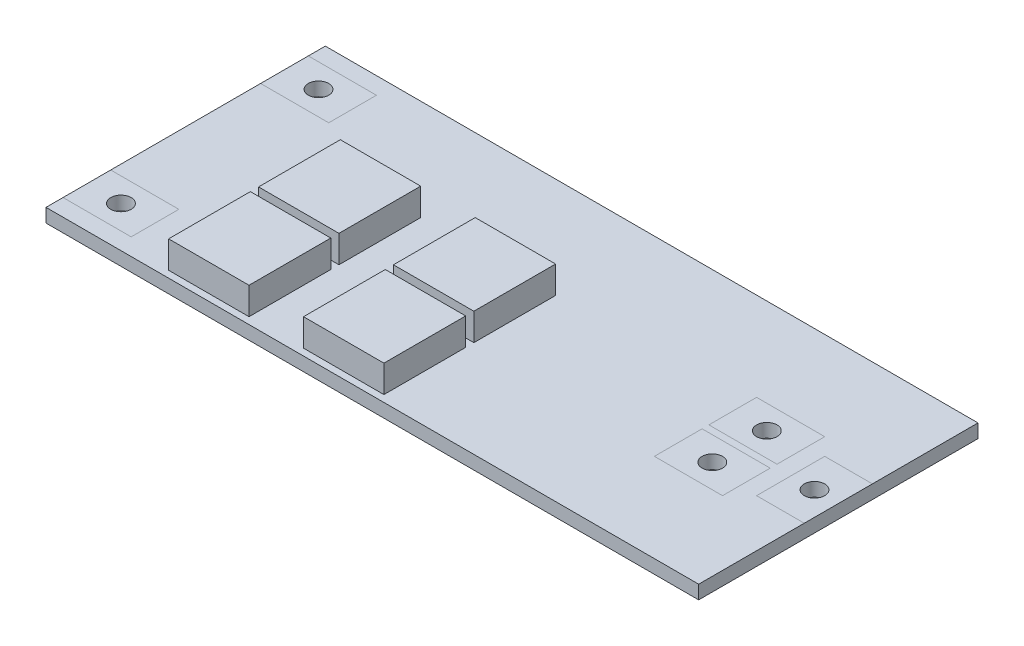
ISO-10303-21;
HEADER;
FILE_DESCRIPTION(('STEP AP214'),'2;1');
FILE_NAME('part.step','',(''),(''),'','','');
FILE_SCHEMA(('AUTOMOTIVE_DESIGN { 1 0 10303 214 1 1 1 1 }'));
ENDSEC;
DATA;
#1=APPLICATION_CONTEXT('core data for automotive mechanical design processes');
#2=APPLICATION_PROTOCOL_DEFINITION('international standard','automotive_design',2000,#1);
#3=PRODUCT_CONTEXT('',#1,'mechanical');
#4=PRODUCT('Part','Part','',(#3));
#5=PRODUCT_RELATED_PRODUCT_CATEGORY('part','',(#4));
#6=PRODUCT_DEFINITION_FORMATION('','',#4);
#7=PRODUCT_DEFINITION_CONTEXT('part definition',#1,'design');
#8=PRODUCT_DEFINITION('design','',#6,#7);
#9=PRODUCT_DEFINITION_SHAPE('','',#8);
#10=(LENGTH_UNIT() NAMED_UNIT(*) SI_UNIT(.MILLI.,.METRE.));
#11=(NAMED_UNIT(*) PLANE_ANGLE_UNIT() SI_UNIT($,.RADIAN.));
#12=(NAMED_UNIT(*) SI_UNIT($,.STERADIAN.) SOLID_ANGLE_UNIT());
#13=UNCERTAINTY_MEASURE_WITH_UNIT(LENGTH_MEASURE(1.E-05),#10,'distance_accuracy_value','');
#14=(GEOMETRIC_REPRESENTATION_CONTEXT(3) GLOBAL_UNCERTAINTY_ASSIGNED_CONTEXT((#13)) GLOBAL_UNIT_ASSIGNED_CONTEXT((#10,
#11,#12)) REPRESENTATION_CONTEXT('',''));
#15=CARTESIAN_POINT('',(0.,0.,0.));
#16=DIRECTION('',(0.,0.,1.));
#17=DIRECTION('',(1.,0.,0.));
#18=AXIS2_PLACEMENT_3D('',#15,#16,#17);
#19=CARTESIAN_POINT('',(0.350000000000003,3.,-2.84999999999999));
#20=DIRECTION('',(-1.,0.,0.));
#21=DIRECTION('',(0.,0.,1.));
#22=AXIS2_PLACEMENT_3D('',#19,#20,#21);
#23=PLANE('',#22);
#24=DIRECTION('',(0.,0.,-1.));
#25=VECTOR('',#24,1.);
#26=CARTESIAN_POINT('',(0.350000000000003,1.,-2.84999999999999));
#27=LINE('',#26,#25);
#28=CARTESIAN_POINT('',(0.350000000000003,1.,3.15000000000001));
#29=VERTEX_POINT('',#28);
#30=CARTESIAN_POINT('',(0.350000000000003,1.,-2.84999999999999));
#31=VERTEX_POINT('',#30);
#32=EDGE_CURVE('E12',#29,#31,#27,.T.);
#33=ORIENTED_EDGE('',*,*,#32,.T.);
#34=DIRECTION('',(0.,-1.,0.));
#35=VECTOR('',#34,1.);
#36=CARTESIAN_POINT('',(0.350000000000003,3.,-2.84999999999999));
#37=LINE('',#36,#35);
#38=CARTESIAN_POINT('',(0.350000000000003,3.,-2.84999999999999));
#39=VERTEX_POINT('',#38);
#40=EDGE_CURVE('E131',#39,#31,#37,.T.);
#41=ORIENTED_EDGE('',*,*,#40,.F.);
#42=DIRECTION('',(0.,0.,-1.));
#43=VECTOR('',#42,1.);
#44=CARTESIAN_POINT('',(0.350000000000003,3.,-2.84999999999999));
#45=LINE('',#44,#43);
#46=CARTESIAN_POINT('',(0.350000000000003,3.,3.15000000000001));
#47=VERTEX_POINT('',#46);
#48=EDGE_CURVE('E64',#47,#39,#45,.T.);
#49=ORIENTED_EDGE('',*,*,#48,.F.);
#50=DIRECTION('',(0.,-1.,0.));
#51=VECTOR('',#50,1.);
#52=CARTESIAN_POINT('',(0.350000000000003,3.,3.15000000000001));
#53=LINE('',#52,#51);
#54=EDGE_CURVE('E119',#47,#29,#53,.T.);
#55=ORIENTED_EDGE('',*,*,#54,.T.);
#56=EDGE_LOOP('',(#33,#41,#49,#55));
#57=FACE_BOUND('',#56,.T.);
#58=ADVANCED_FACE('F60',(#57),#23,.F.);
#59=CARTESIAN_POINT('',(0.350000000000003,3.,-2.84999999999999));
#60=DIRECTION('',(0.,0.,1.));
#61=DIRECTION('',(1.,0.,0.));
#62=AXIS2_PLACEMENT_3D('',#59,#60,#61);
#63=PLANE('',#62);
#64=DIRECTION('',(-1.,0.,0.));
#65=VECTOR('',#64,1.);
#66=CARTESIAN_POINT('',(0.350000000000003,1.,-2.84999999999999));
#67=LINE('',#66,#65);
#68=CARTESIAN_POINT('',(-5.55,1.,-2.85));
#69=VERTEX_POINT('',#68);
#70=EDGE_CURVE('E70',#31,#69,#67,.T.);
#71=ORIENTED_EDGE('',*,*,#70,.T.);
#72=DIRECTION('',(0.,-1.,0.));
#73=VECTOR('',#72,1.);
#74=CARTESIAN_POINT('',(-5.55,3.,-2.85));
#75=LINE('',#74,#73);
#76=CARTESIAN_POINT('',(-5.55,3.,-2.85));
#77=VERTEX_POINT('',#76);
#78=EDGE_CURVE('E115',#77,#69,#75,.T.);
#79=ORIENTED_EDGE('',*,*,#78,.F.);
#80=DIRECTION('',(-1.,0.,0.));
#81=VECTOR('',#80,1.);
#82=CARTESIAN_POINT('',(0.350000000000003,3.,-2.84999999999999));
#83=LINE('',#82,#81);
#84=EDGE_CURVE('E94',#39,#77,#83,.T.);
#85=ORIENTED_EDGE('',*,*,#84,.F.);
#86=ORIENTED_EDGE('',*,*,#40,.T.);
#87=EDGE_LOOP('',(#71,#79,#85,#86));
#88=FACE_BOUND('',#87,.T.);
#89=ADVANCED_FACE('F134',(#88),#63,.F.);
#90=CARTESIAN_POINT('',(-5.55,3.,-2.85));
#91=DIRECTION('',(1.,0.,0.));
#92=DIRECTION('',(0.,0.,-1.));
#93=AXIS2_PLACEMENT_3D('',#90,#91,#92);
#94=PLANE('',#93);
#95=DIRECTION('',(0.,0.,1.));
#96=VECTOR('',#95,1.);
#97=CARTESIAN_POINT('',(-5.55,1.,-2.85));
#98=LINE('',#97,#96);
#99=CARTESIAN_POINT('',(-5.55,1.,3.15));
#100=VERTEX_POINT('',#99);
#101=EDGE_CURVE('E110',#69,#100,#98,.T.);
#102=ORIENTED_EDGE('',*,*,#101,.T.);
#103=DIRECTION('',(0.,-1.,0.));
#104=VECTOR('',#103,1.);
#105=CARTESIAN_POINT('',(-5.55,3.,3.15));
#106=LINE('',#105,#104);
#107=CARTESIAN_POINT('',(-5.55,3.,3.15));
#108=VERTEX_POINT('',#107);
#109=EDGE_CURVE('E113',#108,#100,#106,.T.);
#110=ORIENTED_EDGE('',*,*,#109,.F.);
#111=DIRECTION('',(0.,0.,1.));
#112=VECTOR('',#111,1.);
#113=CARTESIAN_POINT('',(-5.55,3.,-2.85));
#114=LINE('',#113,#112);
#115=EDGE_CURVE('E127',#77,#108,#114,.T.);
#116=ORIENTED_EDGE('',*,*,#115,.F.);
#117=ORIENTED_EDGE('',*,*,#78,.T.);
#118=EDGE_LOOP('',(#102,#110,#116,#117));
#119=FACE_BOUND('',#118,.T.);
#120=ADVANCED_FACE('F111',(#119),#94,.F.);
#121=CARTESIAN_POINT('',(0.350000000000003,3.,3.15000000000001));
#122=DIRECTION('',(0.,0.,-1.));
#123=DIRECTION('',(-1.,0.,0.));
#124=AXIS2_PLACEMENT_3D('',#121,#122,#123);
#125=PLANE('',#124);
#126=DIRECTION('',(1.,0.,0.));
#127=VECTOR('',#126,1.);
#128=CARTESIAN_POINT('',(0.350000000000003,1.,3.15000000000001));
#129=LINE('',#128,#127);
#130=EDGE_CURVE('E104',#100,#29,#129,.T.);
#131=ORIENTED_EDGE('',*,*,#130,.T.);
#132=ORIENTED_EDGE('',*,*,#54,.F.);
#133=DIRECTION('',(1.,0.,0.));
#134=VECTOR('',#133,1.);
#135=CARTESIAN_POINT('',(0.350000000000003,3.,3.15000000000001));
#136=LINE('',#135,#134);
#137=EDGE_CURVE('E118',#108,#47,#136,.T.);
#138=ORIENTED_EDGE('',*,*,#137,.F.);
#139=ORIENTED_EDGE('',*,*,#109,.T.);
#140=EDGE_LOOP('',(#131,#132,#138,#139));
#141=FACE_BOUND('',#140,.T.);
#142=ADVANCED_FACE('F117',(#141),#125,.F.);
#143=CARTESIAN_POINT('',(0.,3.,0.));
#144=DIRECTION('',(0.,-1.,0.));
#145=DIRECTION('',(0.,0.,-1.));
#146=AXIS2_PLACEMENT_3D('',#143,#144,#145);
#147=PLANE('',#146);
#148=ORIENTED_EDGE('',*,*,#48,.T.);
#149=ORIENTED_EDGE('',*,*,#84,.T.);
#150=ORIENTED_EDGE('',*,*,#115,.T.);
#151=ORIENTED_EDGE('',*,*,#137,.T.);
#152=EDGE_LOOP('',(#148,#149,#150,#151));
#153=FACE_BOUND('',#152,.T.);
#154=ADVANCED_FACE('F62',(#153),#147,.F.);
#155=CARTESIAN_POINT('',(0.,1.,0.));
#156=DIRECTION('',(0.,-1.,0.));
#157=DIRECTION('',(0.,0.,-1.));
#158=AXIS2_PLACEMENT_3D('',#155,#156,#157);
#159=PLANE('',#158);
#160=ORIENTED_EDGE('',*,*,#32,.F.);
#161=ORIENTED_EDGE('',*,*,#130,.F.);
#162=ORIENTED_EDGE('',*,*,#101,.F.);
#163=ORIENTED_EDGE('',*,*,#70,.F.);
#164=EDGE_LOOP('',(#160,#161,#162,#163));
#165=FACE_BOUND('',#164,.T.);
#166=ADVANCED_FACE('F121',(#165),#159,.T.);
#167=CLOSED_SHELL('',(#58,#89,#120,#142,#154,#166));
#168=MANIFOLD_SOLID_BREP('B2',#167);
#169=CARTESIAN_POINT('',(0.350000000000001,3.,3.75000000000001));
#170=DIRECTION('',(-1.,0.,0.));
#171=DIRECTION('',(0.,0.,1.));
#172=AXIS2_PLACEMENT_3D('',#169,#170,#171);
#173=PLANE('',#172);
#174=DIRECTION('',(0.,0.,-1.));
#175=VECTOR('',#174,1.);
#176=CARTESIAN_POINT('',(0.350000000000001,1.,3.75000000000001));
#177=LINE('',#176,#175);
#178=CARTESIAN_POINT('',(0.349999999999996,1.,9.75000000000001));
#179=VERTEX_POINT('',#178);
#180=CARTESIAN_POINT('',(0.350000000000001,1.,3.75000000000001));
#181=VERTEX_POINT('',#180);
#182=EDGE_CURVE('E58',#179,#181,#177,.T.);
#183=ORIENTED_EDGE('',*,*,#182,.T.);
#184=DIRECTION('',(0.,-1.,0.));
#185=VECTOR('',#184,1.);
#186=CARTESIAN_POINT('',(0.350000000000001,3.,3.75000000000001));
#187=LINE('',#186,#185);
#188=CARTESIAN_POINT('',(0.350000000000001,3.,3.75000000000001));
#189=VERTEX_POINT('',#188);
#190=EDGE_CURVE('E265',#189,#181,#187,.T.);
#191=ORIENTED_EDGE('',*,*,#190,.F.);
#192=DIRECTION('',(0.,0.,-1.));
#193=VECTOR('',#192,1.);
#194=CARTESIAN_POINT('',(0.350000000000001,3.,3.75000000000001));
#195=LINE('',#194,#193);
#196=CARTESIAN_POINT('',(0.349999999999996,3.,9.75000000000001));
#197=VERTEX_POINT('',#196);
#198=EDGE_CURVE('E198',#197,#189,#195,.T.);
#199=ORIENTED_EDGE('',*,*,#198,.F.);
#200=DIRECTION('',(0.,-1.,0.));
#201=VECTOR('',#200,1.);
#202=CARTESIAN_POINT('',(0.349999999999996,3.,9.75000000000001));
#203=LINE('',#202,#201);
#204=EDGE_CURVE('E253',#197,#179,#203,.T.);
#205=ORIENTED_EDGE('',*,*,#204,.T.);
#206=EDGE_LOOP('',(#183,#191,#199,#205));
#207=FACE_BOUND('',#206,.T.);
#208=ADVANCED_FACE('F194',(#207),#173,.F.);
#209=CARTESIAN_POINT('',(0.350000000000001,3.,3.75000000000001));
#210=DIRECTION('',(0.,0.,1.));
#211=DIRECTION('',(1.,0.,0.));
#212=AXIS2_PLACEMENT_3D('',#209,#210,#211);
#213=PLANE('',#212);
#214=DIRECTION('',(-1.,0.,0.));
#215=VECTOR('',#214,1.);
#216=CARTESIAN_POINT('',(0.350000000000001,1.,3.75000000000001));
#217=LINE('',#216,#215);
#218=CARTESIAN_POINT('',(-5.55,1.,3.75));
#219=VERTEX_POINT('',#218);
#220=EDGE_CURVE('E204',#181,#219,#217,.T.);
#221=ORIENTED_EDGE('',*,*,#220,.T.);
#222=DIRECTION('',(0.,-1.,0.));
#223=VECTOR('',#222,1.);
#224=CARTESIAN_POINT('',(-5.55,3.,3.75));
#225=LINE('',#224,#223);
#226=CARTESIAN_POINT('',(-5.55,3.,3.75));
#227=VERTEX_POINT('',#226);
#228=EDGE_CURVE('E249',#227,#219,#225,.T.);
#229=ORIENTED_EDGE('',*,*,#228,.F.);
#230=DIRECTION('',(-1.,0.,0.));
#231=VECTOR('',#230,1.);
#232=CARTESIAN_POINT('',(0.350000000000001,3.,3.75000000000001));
#233=LINE('',#232,#231);
#234=EDGE_CURVE('E228',#189,#227,#233,.T.);
#235=ORIENTED_EDGE('',*,*,#234,.F.);
#236=ORIENTED_EDGE('',*,*,#190,.T.);
#237=EDGE_LOOP('',(#221,#229,#235,#236));
#238=FACE_BOUND('',#237,.T.);
#239=ADVANCED_FACE('F268',(#238),#213,.F.);
#240=CARTESIAN_POINT('',(-5.55,3.,3.75));
#241=DIRECTION('',(1.,0.,0.));
#242=DIRECTION('',(0.,0.,-1.));
#243=AXIS2_PLACEMENT_3D('',#240,#241,#242);
#244=PLANE('',#243);
#245=DIRECTION('',(0.,0.,1.));
#246=VECTOR('',#245,1.);
#247=CARTESIAN_POINT('',(-5.55,1.,3.75));
#248=LINE('',#247,#246);
#249=CARTESIAN_POINT('',(-5.55,1.,9.75));
#250=VERTEX_POINT('',#249);
#251=EDGE_CURVE('E244',#219,#250,#248,.T.);
#252=ORIENTED_EDGE('',*,*,#251,.T.);
#253=DIRECTION('',(0.,-1.,0.));
#254=VECTOR('',#253,1.);
#255=CARTESIAN_POINT('',(-5.55,3.,9.75));
#256=LINE('',#255,#254);
#257=CARTESIAN_POINT('',(-5.55,3.,9.75));
#258=VERTEX_POINT('',#257);
#259=EDGE_CURVE('E247',#258,#250,#256,.T.);
#260=ORIENTED_EDGE('',*,*,#259,.F.);
#261=DIRECTION('',(0.,0.,1.));
#262=VECTOR('',#261,1.);
#263=CARTESIAN_POINT('',(-5.55,3.,3.75));
#264=LINE('',#263,#262);
#265=EDGE_CURVE('E261',#227,#258,#264,.T.);
#266=ORIENTED_EDGE('',*,*,#265,.F.);
#267=ORIENTED_EDGE('',*,*,#228,.T.);
#268=EDGE_LOOP('',(#252,#260,#266,#267));
#269=FACE_BOUND('',#268,.T.);
#270=ADVANCED_FACE('F245',(#269),#244,.F.);
#271=CARTESIAN_POINT('',(0.349999999999996,3.,9.75000000000001));
#272=DIRECTION('',(0.,0.,-1.));
#273=DIRECTION('',(-1.,0.,0.));
#274=AXIS2_PLACEMENT_3D('',#271,#272,#273);
#275=PLANE('',#274);
#276=DIRECTION('',(1.,0.,0.));
#277=VECTOR('',#276,1.);
#278=CARTESIAN_POINT('',(0.349999999999996,1.,9.75000000000001));
#279=LINE('',#278,#277);
#280=EDGE_CURVE('E238',#250,#179,#279,.T.);
#281=ORIENTED_EDGE('',*,*,#280,.T.);
#282=ORIENTED_EDGE('',*,*,#204,.F.);
#283=DIRECTION('',(1.,0.,0.));
#284=VECTOR('',#283,1.);
#285=CARTESIAN_POINT('',(0.349999999999996,3.,9.75000000000001));
#286=LINE('',#285,#284);
#287=EDGE_CURVE('E252',#258,#197,#286,.T.);
#288=ORIENTED_EDGE('',*,*,#287,.F.);
#289=ORIENTED_EDGE('',*,*,#259,.T.);
#290=EDGE_LOOP('',(#281,#282,#288,#289));
#291=FACE_BOUND('',#290,.T.);
#292=ADVANCED_FACE('F251',(#291),#275,.F.);
#293=CARTESIAN_POINT('',(0.,3.,0.));
#294=DIRECTION('',(0.,-1.,0.));
#295=DIRECTION('',(0.,0.,-1.));
#296=AXIS2_PLACEMENT_3D('',#293,#294,#295);
#297=PLANE('',#296);
#298=ORIENTED_EDGE('',*,*,#198,.T.);
#299=ORIENTED_EDGE('',*,*,#234,.T.);
#300=ORIENTED_EDGE('',*,*,#265,.T.);
#301=ORIENTED_EDGE('',*,*,#287,.T.);
#302=EDGE_LOOP('',(#298,#299,#300,#301));
#303=FACE_BOUND('',#302,.T.);
#304=ADVANCED_FACE('F196',(#303),#297,.F.);
#305=CARTESIAN_POINT('',(0.,1.,0.));
#306=DIRECTION('',(0.,-1.,0.));
#307=DIRECTION('',(0.,0.,-1.));
#308=AXIS2_PLACEMENT_3D('',#305,#306,#307);
#309=PLANE('',#308);
#310=ORIENTED_EDGE('',*,*,#182,.F.);
#311=ORIENTED_EDGE('',*,*,#280,.F.);
#312=ORIENTED_EDGE('',*,*,#251,.F.);
#313=ORIENTED_EDGE('',*,*,#220,.F.);
#314=EDGE_LOOP('',(#310,#311,#312,#313));
#315=FACE_BOUND('',#314,.T.);
#316=ADVANCED_FACE('F255',(#315),#309,.T.);
#317=CLOSED_SHELL('',(#208,#239,#270,#292,#304,#316));
#318=MANIFOLD_SOLID_BREP('B6',#317);
#319=CARTESIAN_POINT('',(-15.45,3.,3.75));
#320=DIRECTION('',(1.,0.,0.));
#321=DIRECTION('',(0.,0.,-1.));
#322=AXIS2_PLACEMENT_3D('',#319,#320,#321);
#323=PLANE('',#322);
#324=DIRECTION('',(0.,0.,1.));
#325=VECTOR('',#324,1.);
#326=CARTESIAN_POINT('',(-15.45,1.,3.75));
#327=LINE('',#326,#325);
#328=CARTESIAN_POINT('',(-15.45,1.,3.75));
#329=VERTEX_POINT('',#328);
#330=CARTESIAN_POINT('',(-15.45,1.,9.75));
#331=VERTEX_POINT('',#330);
#332=EDGE_CURVE('E192',#329,#331,#327,.T.);
#333=ORIENTED_EDGE('',*,*,#332,.T.);
#334=DIRECTION('',(0.,-1.,0.));
#335=VECTOR('',#334,1.);
#336=CARTESIAN_POINT('',(-15.45,3.,9.75));
#337=LINE('',#336,#335);
#338=CARTESIAN_POINT('',(-15.45,3.,9.75));
#339=VERTEX_POINT('',#338);
#340=EDGE_CURVE('E399',#339,#331,#337,.T.);
#341=ORIENTED_EDGE('',*,*,#340,.F.);
#342=DIRECTION('',(0.,0.,1.));
#343=VECTOR('',#342,1.);
#344=CARTESIAN_POINT('',(-15.45,3.,3.75));
#345=LINE('',#344,#343);
#346=CARTESIAN_POINT('',(-15.45,3.,3.75));
#347=VERTEX_POINT('',#346);
#348=EDGE_CURVE('E332',#347,#339,#345,.T.);
#349=ORIENTED_EDGE('',*,*,#348,.F.);
#350=DIRECTION('',(0.,-1.,0.));
#351=VECTOR('',#350,1.);
#352=CARTESIAN_POINT('',(-15.45,3.,3.75));
#353=LINE('',#352,#351);
#354=EDGE_CURVE('E387',#347,#329,#353,.T.);
#355=ORIENTED_EDGE('',*,*,#354,.T.);
#356=EDGE_LOOP('',(#333,#341,#349,#355));
#357=FACE_BOUND('',#356,.T.);
#358=ADVANCED_FACE('F328',(#357),#323,.F.);
#359=CARTESIAN_POINT('',(-15.45,3.,9.75));
#360=DIRECTION('',(0.,0.,-1.));
#361=DIRECTION('',(-1.,0.,0.));
#362=AXIS2_PLACEMENT_3D('',#359,#360,#361);
#363=PLANE('',#362);
#364=DIRECTION('',(1.,0.,0.));
#365=VECTOR('',#364,1.);
#366=CARTESIAN_POINT('',(-15.45,1.,9.75));
#367=LINE('',#366,#365);
#368=CARTESIAN_POINT('',(-9.55,1.,9.75));
#369=VERTEX_POINT('',#368);
#370=EDGE_CURVE('E338',#331,#369,#367,.T.);
#371=ORIENTED_EDGE('',*,*,#370,.T.);
#372=DIRECTION('',(0.,-1.,0.));
#373=VECTOR('',#372,1.);
#374=CARTESIAN_POINT('',(-9.55,3.,9.75));
#375=LINE('',#374,#373);
#376=CARTESIAN_POINT('',(-9.55,3.,9.75));
#377=VERTEX_POINT('',#376);
#378=EDGE_CURVE('E383',#377,#369,#375,.T.);
#379=ORIENTED_EDGE('',*,*,#378,.F.);
#380=DIRECTION('',(1.,0.,0.));
#381=VECTOR('',#380,1.);
#382=CARTESIAN_POINT('',(-15.45,3.,9.75));
#383=LINE('',#382,#381);
#384=EDGE_CURVE('E362',#339,#377,#383,.T.);
#385=ORIENTED_EDGE('',*,*,#384,.F.);
#386=ORIENTED_EDGE('',*,*,#340,.T.);
#387=EDGE_LOOP('',(#371,#379,#385,#386));
#388=FACE_BOUND('',#387,.T.);
#389=ADVANCED_FACE('F402',(#388),#363,.F.);
#390=CARTESIAN_POINT('',(-9.55,3.,3.75));
#391=DIRECTION('',(-1.,0.,0.));
#392=DIRECTION('',(0.,0.,1.));
#393=AXIS2_PLACEMENT_3D('',#390,#391,#392);
#394=PLANE('',#393);
#395=DIRECTION('',(0.,0.,-1.));
#396=VECTOR('',#395,1.);
#397=CARTESIAN_POINT('',(-9.55,1.,3.75));
#398=LINE('',#397,#396);
#399=CARTESIAN_POINT('',(-9.55,1.,3.75));
#400=VERTEX_POINT('',#399);
#401=EDGE_CURVE('E378',#369,#400,#398,.T.);
#402=ORIENTED_EDGE('',*,*,#401,.T.);
#403=DIRECTION('',(0.,-1.,0.));
#404=VECTOR('',#403,1.);
#405=CARTESIAN_POINT('',(-9.55,3.,3.75));
#406=LINE('',#405,#404);
#407=CARTESIAN_POINT('',(-9.55,3.,3.75));
#408=VERTEX_POINT('',#407);
#409=EDGE_CURVE('E381',#408,#400,#406,.T.);
#410=ORIENTED_EDGE('',*,*,#409,.F.);
#411=DIRECTION('',(0.,0.,-1.));
#412=VECTOR('',#411,1.);
#413=CARTESIAN_POINT('',(-9.55,3.,3.75));
#414=LINE('',#413,#412);
#415=EDGE_CURVE('E395',#377,#408,#414,.T.);
#416=ORIENTED_EDGE('',*,*,#415,.F.);
#417=ORIENTED_EDGE('',*,*,#378,.T.);
#418=EDGE_LOOP('',(#402,#410,#416,#417));
#419=FACE_BOUND('',#418,.T.);
#420=ADVANCED_FACE('F379',(#419),#394,.F.);
#421=CARTESIAN_POINT('',(-15.45,3.,3.75));
#422=DIRECTION('',(0.,0.,1.));
#423=DIRECTION('',(1.,0.,0.));
#424=AXIS2_PLACEMENT_3D('',#421,#422,#423);
#425=PLANE('',#424);
#426=DIRECTION('',(-1.,0.,0.));
#427=VECTOR('',#426,1.);
#428=CARTESIAN_POINT('',(-15.45,1.,3.75));
#429=LINE('',#428,#427);
#430=EDGE_CURVE('E372',#400,#329,#429,.T.);
#431=ORIENTED_EDGE('',*,*,#430,.T.);
#432=ORIENTED_EDGE('',*,*,#354,.F.);
#433=DIRECTION('',(-1.,0.,0.));
#434=VECTOR('',#433,1.);
#435=CARTESIAN_POINT('',(-15.45,3.,3.75));
#436=LINE('',#435,#434);
#437=EDGE_CURVE('E386',#408,#347,#436,.T.);
#438=ORIENTED_EDGE('',*,*,#437,.F.);
#439=ORIENTED_EDGE('',*,*,#409,.T.);
#440=EDGE_LOOP('',(#431,#432,#438,#439));
#441=FACE_BOUND('',#440,.T.);
#442=ADVANCED_FACE('F385',(#441),#425,.F.);
#443=CARTESIAN_POINT('',(0.,3.,0.));
#444=DIRECTION('',(0.,1.,0.));
#445=DIRECTION('',(0.,0.,1.));
#446=AXIS2_PLACEMENT_3D('',#443,#444,#445);
#447=PLANE('',#446);
#448=ORIENTED_EDGE('',*,*,#348,.T.);
#449=ORIENTED_EDGE('',*,*,#384,.T.);
#450=ORIENTED_EDGE('',*,*,#415,.T.);
#451=ORIENTED_EDGE('',*,*,#437,.T.);
#452=EDGE_LOOP('',(#448,#449,#450,#451));
#453=FACE_BOUND('',#452,.T.);
#454=ADVANCED_FACE('F330',(#453),#447,.T.);
#455=CARTESIAN_POINT('',(0.,1.,0.));
#456=DIRECTION('',(0.,1.,0.));
#457=DIRECTION('',(0.,0.,1.));
#458=AXIS2_PLACEMENT_3D('',#455,#456,#457);
#459=PLANE('',#458);
#460=ORIENTED_EDGE('',*,*,#332,.F.);
#461=ORIENTED_EDGE('',*,*,#430,.F.);
#462=ORIENTED_EDGE('',*,*,#401,.F.);
#463=ORIENTED_EDGE('',*,*,#370,.F.);
#464=EDGE_LOOP('',(#460,#461,#462,#463));
#465=FACE_BOUND('',#464,.T.);
#466=ADVANCED_FACE('F389',(#465),#459,.F.);
#467=CLOSED_SHELL('',(#358,#389,#420,#442,#454,#466));
#468=MANIFOLD_SOLID_BREP('B52',#467);
#469=CARTESIAN_POINT('',(-15.45,3.,-2.85));
#470=DIRECTION('',(1.,0.,0.));
#471=DIRECTION('',(0.,0.,-1.));
#472=AXIS2_PLACEMENT_3D('',#469,#470,#471);
#473=PLANE('',#472);
#474=DIRECTION('',(0.,0.,1.));
#475=VECTOR('',#474,1.);
#476=CARTESIAN_POINT('',(-15.45,1.,-2.85));
#477=LINE('',#476,#475);
#478=CARTESIAN_POINT('',(-15.45,1.,-2.85));
#479=VERTEX_POINT('',#478);
#480=CARTESIAN_POINT('',(-15.45,1.,3.15));
#481=VERTEX_POINT('',#480);
#482=EDGE_CURVE('E524',#479,#481,#477,.T.);
#483=ORIENTED_EDGE('',*,*,#482,.T.);
#484=DIRECTION('',(0.,-1.,0.));
#485=VECTOR('',#484,1.);
#486=CARTESIAN_POINT('',(-15.45,3.,3.15));
#487=LINE('',#486,#485);
#488=CARTESIAN_POINT('',(-15.45,3.,3.15));
#489=VERTEX_POINT('',#488);
#490=EDGE_CURVE('E326',#489,#481,#487,.T.);
#491=ORIENTED_EDGE('',*,*,#490,.F.);
#492=DIRECTION('',(0.,0.,1.));
#493=VECTOR('',#492,1.);
#494=CARTESIAN_POINT('',(-15.45,3.,-2.85));
#495=LINE('',#494,#493);
#496=CARTESIAN_POINT('',(-15.45,3.,-2.85));
#497=VERTEX_POINT('',#496);
#498=EDGE_CURVE('E512',#497,#489,#495,.T.);
#499=ORIENTED_EDGE('',*,*,#498,.F.);
#500=DIRECTION('',(0.,-1.,0.));
#501=VECTOR('',#500,1.);
#502=CARTESIAN_POINT('',(-15.45,3.,-2.85));
#503=LINE('',#502,#501);
#504=EDGE_CURVE('E520',#497,#479,#503,.T.);
#505=ORIENTED_EDGE('',*,*,#504,.T.);
#506=EDGE_LOOP('',(#483,#491,#499,#505));
#507=FACE_BOUND('',#506,.T.);
#508=ADVANCED_FACE('F461',(#507),#473,.F.);
#509=CARTESIAN_POINT('',(-15.45,3.,3.15));
#510=DIRECTION('',(0.,0.,-1.));
#511=DIRECTION('',(-1.,0.,0.));
#512=AXIS2_PLACEMENT_3D('',#509,#510,#511);
#513=PLANE('',#512);
#514=DIRECTION('',(1.,0.,0.));
#515=VECTOR('',#514,1.);
#516=CARTESIAN_POINT('',(-15.45,1.,3.15));
#517=LINE('',#516,#515);
#518=CARTESIAN_POINT('',(-9.55,1.,3.15));
#519=VERTEX_POINT('',#518);
#520=EDGE_CURVE('E516',#481,#519,#517,.T.);
#521=ORIENTED_EDGE('',*,*,#520,.T.);
#522=DIRECTION('',(0.,-1.,0.));
#523=VECTOR('',#522,1.);
#524=CARTESIAN_POINT('',(-9.55,3.,3.15));
#525=LINE('',#524,#523);
#526=CARTESIAN_POINT('',(-9.55,3.,3.15));
#527=VERTEX_POINT('',#526);
#528=EDGE_CURVE('E469',#527,#519,#525,.T.);
#529=ORIENTED_EDGE('',*,*,#528,.F.);
#530=DIRECTION('',(1.,0.,0.));
#531=VECTOR('',#530,1.);
#532=CARTESIAN_POINT('',(-15.45,3.,3.15));
#533=LINE('',#532,#531);
#534=EDGE_CURVE('E507',#489,#527,#533,.T.);
#535=ORIENTED_EDGE('',*,*,#534,.F.);
#536=ORIENTED_EDGE('',*,*,#490,.T.);
#537=EDGE_LOOP('',(#521,#529,#535,#536));
#538=FACE_BOUND('',#537,.T.);
#539=ADVANCED_FACE('F515',(#538),#513,.F.);
#540=CARTESIAN_POINT('',(-9.55,3.,-2.85));
#541=DIRECTION('',(-1.,0.,0.));
#542=DIRECTION('',(0.,0.,1.));
#543=AXIS2_PLACEMENT_3D('',#540,#541,#542);
#544=PLANE('',#543);
#545=DIRECTION('',(0.,0.,-1.));
#546=VECTOR('',#545,1.);
#547=CARTESIAN_POINT('',(-9.55,1.,-2.85));
#548=LINE('',#547,#546);
#549=CARTESIAN_POINT('',(-9.55,1.,-2.85));
#550=VERTEX_POINT('',#549);
#551=EDGE_CURVE('E494',#519,#550,#548,.T.);
#552=ORIENTED_EDGE('',*,*,#551,.T.);
#553=DIRECTION('',(0.,-1.,0.));
#554=VECTOR('',#553,1.);
#555=CARTESIAN_POINT('',(-9.55,3.,-2.85));
#556=LINE('',#555,#554);
#557=CARTESIAN_POINT('',(-9.55,3.,-2.85));
#558=VERTEX_POINT('',#557);
#559=EDGE_CURVE('E517',#558,#550,#556,.T.);
#560=ORIENTED_EDGE('',*,*,#559,.F.);
#561=DIRECTION('',(0.,0.,-1.));
#562=VECTOR('',#561,1.);
#563=CARTESIAN_POINT('',(-9.55,3.,-2.85));
#564=LINE('',#563,#562);
#565=EDGE_CURVE('E510',#527,#558,#564,.T.);
#566=ORIENTED_EDGE('',*,*,#565,.F.);
#567=ORIENTED_EDGE('',*,*,#528,.T.);
#568=EDGE_LOOP('',(#552,#560,#566,#567));
#569=FACE_BOUND('',#568,.T.);
#570=ADVANCED_FACE('F518',(#569),#544,.F.);
#571=CARTESIAN_POINT('',(-15.45,3.,-2.85));
#572=DIRECTION('',(0.,0.,1.));
#573=DIRECTION('',(1.,0.,0.));
#574=AXIS2_PLACEMENT_3D('',#571,#572,#573);
#575=PLANE('',#574);
#576=DIRECTION('',(-1.,0.,0.));
#577=VECTOR('',#576,1.);
#578=CARTESIAN_POINT('',(-15.45,1.,-2.85));
#579=LINE('',#578,#577);
#580=EDGE_CURVE('E500',#550,#479,#579,.T.);
#581=ORIENTED_EDGE('',*,*,#580,.T.);
#582=ORIENTED_EDGE('',*,*,#504,.F.);
#583=DIRECTION('',(-1.,0.,0.));
#584=VECTOR('',#583,1.);
#585=CARTESIAN_POINT('',(-15.45,3.,-2.85));
#586=LINE('',#585,#584);
#587=EDGE_CURVE('E477',#558,#497,#586,.T.);
#588=ORIENTED_EDGE('',*,*,#587,.F.);
#589=ORIENTED_EDGE('',*,*,#559,.T.);
#590=EDGE_LOOP('',(#581,#582,#588,#589));
#591=FACE_BOUND('',#590,.T.);
#592=ADVANCED_FACE('F531',(#591),#575,.F.);
#593=CARTESIAN_POINT('',(0.,3.,0.));
#594=DIRECTION('',(0.,1.,0.));
#595=DIRECTION('',(0.,0.,1.));
#596=AXIS2_PLACEMENT_3D('',#593,#594,#595);
#597=PLANE('',#596);
#598=ORIENTED_EDGE('',*,*,#498,.T.);
#599=ORIENTED_EDGE('',*,*,#534,.T.);
#600=ORIENTED_EDGE('',*,*,#565,.T.);
#601=ORIENTED_EDGE('',*,*,#587,.T.);
#602=EDGE_LOOP('',(#598,#599,#600,#601));
#603=FACE_BOUND('',#602,.T.);
#604=ADVANCED_FACE('F508',(#603),#597,.T.);
#605=CARTESIAN_POINT('',(0.,1.,0.));
#606=DIRECTION('',(0.,1.,0.));
#607=DIRECTION('',(0.,0.,1.));
#608=AXIS2_PLACEMENT_3D('',#605,#606,#607);
#609=PLANE('',#608);
#610=ORIENTED_EDGE('',*,*,#482,.F.);
#611=ORIENTED_EDGE('',*,*,#580,.F.);
#612=ORIENTED_EDGE('',*,*,#551,.F.);
#613=ORIENTED_EDGE('',*,*,#520,.F.);
#614=EDGE_LOOP('',(#610,#611,#612,#613));
#615=FACE_BOUND('',#614,.T.);
#616=ADVANCED_FACE('F534',(#615),#609,.F.);
#617=CLOSED_SHELL('',(#508,#539,#570,#592,#604,#616));
#618=MANIFOLD_SOLID_BREP('B186',#617);
#619=CARTESIAN_POINT('',(0.,1.,0.));
#620=DIRECTION('',(0.,1.,0.));
#621=DIRECTION('',(0.,0.,1.));
#622=AXIS2_PLACEMENT_3D('',#619,#620,#621);
#623=PLANE('',#622);
#624=DIRECTION('',(-1.,0.,0.));
#625=VECTOR('',#624,1.);
#626=CARTESIAN_POINT('',(0.,1.,3.75));
#627=LINE('',#626,#625);
#628=CARTESIAN_POINT('',(19.2,1.,3.74999999999999));
#629=VERTEX_POINT('',#628);
#630=CARTESIAN_POINT('',(14.2,1.,3.75));
#631=VERTEX_POINT('',#630);
#632=EDGE_CURVE('E755',#629,#631,#627,.T.);
#633=ORIENTED_EDGE('',*,*,#632,.T.);
#634=DIRECTION('',(0.,0.,-1.));
#635=VECTOR('',#634,1.);
#636=CARTESIAN_POINT('',(14.2,1.,0.));
#637=LINE('',#636,#635);
#638=CARTESIAN_POINT('',(14.2,1.,0.249999999999996));
#639=VERTEX_POINT('',#638);
#640=EDGE_CURVE('E759',#631,#639,#637,.T.);
#641=ORIENTED_EDGE('',*,*,#640,.T.);
#642=DIRECTION('',(1.,0.,0.));
#643=VECTOR('',#642,1.);
#644=CARTESIAN_POINT('',(0.,1.,0.25));
#645=LINE('',#644,#643);
#646=CARTESIAN_POINT('',(19.2,1.,0.249999999999995));
#647=VERTEX_POINT('',#646);
#648=EDGE_CURVE('E747',#639,#647,#645,.T.);
#649=ORIENTED_EDGE('',*,*,#648,.T.);
#650=DIRECTION('',(0.,0.,1.));
#651=VECTOR('',#650,1.);
#652=CARTESIAN_POINT('',(19.2,1.,0.));
#653=LINE('',#652,#651);
#654=EDGE_CURVE('E751',#647,#629,#653,.T.);
#655=ORIENTED_EDGE('',*,*,#654,.T.);
#656=EDGE_LOOP('',(#633,#641,#649,#655));
#657=FACE_BOUND('',#656,.T.);
#658=DIRECTION('',(1.,0.,0.));
#659=VECTOR('',#658,1.);
#660=CARTESIAN_POINT('',(0.,1.,-3.75));
#661=LINE('',#660,#659);
#662=CARTESIAN_POINT('',(14.2,1.,-3.75));
#663=VERTEX_POINT('',#662);
#664=CARTESIAN_POINT('',(19.2,1.,-3.75));
#665=VERTEX_POINT('',#664);
#666=EDGE_CURVE('E732',#663,#665,#661,.T.);
#667=ORIENTED_EDGE('',*,*,#666,.T.);
#668=DIRECTION('',(0.,0.,1.));
#669=VECTOR('',#668,1.);
#670=CARTESIAN_POINT('',(19.2,1.,0.));
#671=LINE('',#670,#669);
#672=CARTESIAN_POINT('',(19.2,1.,-0.25));
#673=VERTEX_POINT('',#672);
#674=EDGE_CURVE('E736',#665,#673,#671,.T.);
#675=ORIENTED_EDGE('',*,*,#674,.T.);
#676=DIRECTION('',(-1.,0.,0.));
#677=VECTOR('',#676,1.);
#678=CARTESIAN_POINT('',(0.,1.,-0.25));
#679=LINE('',#678,#677);
#680=CARTESIAN_POINT('',(14.2,1.,-0.25));
#681=VERTEX_POINT('',#680);
#682=EDGE_CURVE('E724',#673,#681,#679,.T.);
#683=ORIENTED_EDGE('',*,*,#682,.T.);
#684=DIRECTION('',(0.,0.,-1.));
#685=VECTOR('',#684,1.);
#686=CARTESIAN_POINT('',(14.2,1.,0.));
#687=LINE('',#686,#685);
#688=EDGE_CURVE('E728',#681,#663,#687,.T.);
#689=ORIENTED_EDGE('',*,*,#688,.T.);
#690=EDGE_LOOP('',(#667,#675,#683,#689));
#691=FACE_BOUND('',#690,.T.);
#692=DIRECTION('',(0.,0.,1.));
#693=VECTOR('',#692,1.);
#694=CARTESIAN_POINT('',(-23.95,1.,-10.25));
#695=LINE('',#694,#693);
#696=CARTESIAN_POINT('',(-23.95,1.,-5.49999999999999));
#697=VERTEX_POINT('',#696);
#698=CARTESIAN_POINT('',(-23.95,1.,5.49999999999999));
#699=VERTEX_POINT('',#698);
#700=EDGE_CURVE('E814',#697,#699,#695,.T.);
#701=ORIENTED_EDGE('',*,*,#700,.T.);
#702=DIRECTION('',(1.,0.,0.));
#703=VECTOR('',#702,1.);
#704=CARTESIAN_POINT('',(0.,1.,5.49999999999999));
#705=LINE('',#704,#703);
#706=CARTESIAN_POINT('',(-18.95,1.,5.49999999999999));
#707=VERTEX_POINT('',#706);
#708=EDGE_CURVE('E459',#699,#707,#705,.T.);
#709=ORIENTED_EDGE('',*,*,#708,.T.);
#710=DIRECTION('',(0.,0.,1.));
#711=VECTOR('',#710,1.);
#712=CARTESIAN_POINT('',(-18.95,1.,0.));
#713=LINE('',#712,#711);
#714=CARTESIAN_POINT('',(-18.95,1.,8.99999999999999));
#715=VERTEX_POINT('',#714);
#716=EDGE_CURVE('E594',#707,#715,#713,.T.);
#717=ORIENTED_EDGE('',*,*,#716,.T.);
#718=DIRECTION('',(-1.,0.,0.));
#719=VECTOR('',#718,1.);
#720=CARTESIAN_POINT('',(0.,1.,8.99999999999999));
#721=LINE('',#720,#719);
#722=CARTESIAN_POINT('',(-23.95,1.,8.99999999999999));
#723=VERTEX_POINT('',#722);
#724=EDGE_CURVE('E762',#715,#723,#721,.T.);
#725=ORIENTED_EDGE('',*,*,#724,.T.);
#726=CARTESIAN_POINT('',(-23.95,1.,10.25));
#727=VERTEX_POINT('',#726);
#728=EDGE_CURVE('E703',#723,#727,#695,.T.);
#729=ORIENTED_EDGE('',*,*,#728,.T.);
#730=DIRECTION('',(1.,0.,0.));
#731=VECTOR('',#730,1.);
#732=CARTESIAN_POINT('',(-23.95,1.,10.25));
#733=LINE('',#732,#731);
#734=CARTESIAN_POINT('',(23.95,1.,10.25));
#735=VERTEX_POINT('',#734);
#736=EDGE_CURVE('E817',#727,#735,#733,.T.);
#737=ORIENTED_EDGE('',*,*,#736,.T.);
#738=DIRECTION('',(0.,0.,-1.));
#739=VECTOR('',#738,1.);
#740=CARTESIAN_POINT('',(23.95,1.,-10.25));
#741=LINE('',#740,#739);
#742=CARTESIAN_POINT('',(23.95,1.,2.5));
#743=VERTEX_POINT('',#742);
#744=EDGE_CURVE('E694',#735,#743,#741,.T.);
#745=ORIENTED_EDGE('',*,*,#744,.T.);
#746=DIRECTION('',(-1.,0.,0.));
#747=VECTOR('',#746,1.);
#748=CARTESIAN_POINT('',(0.,1.,2.5));
#749=LINE('',#748,#747);
#750=CARTESIAN_POINT('',(20.45,1.,2.5));
#751=VERTEX_POINT('',#750);
#752=EDGE_CURVE('E744',#743,#751,#749,.T.);
#753=ORIENTED_EDGE('',*,*,#752,.T.);
#754=DIRECTION('',(0.,0.,-1.));
#755=VECTOR('',#754,1.);
#756=CARTESIAN_POINT('',(20.45,1.,0.));
#757=LINE('',#756,#755);
#758=CARTESIAN_POINT('',(20.45,1.,-2.5));
#759=VERTEX_POINT('',#758);
#760=EDGE_CURVE('E741',#751,#759,#757,.T.);
#761=ORIENTED_EDGE('',*,*,#760,.T.);
#762=DIRECTION('',(1.,0.,0.));
#763=VECTOR('',#762,1.);
#764=CARTESIAN_POINT('',(0.,1.,-2.5));
#765=LINE('',#764,#763);
#766=CARTESIAN_POINT('',(23.95,1.,-2.5));
#767=VERTEX_POINT('',#766);
#768=EDGE_CURVE('E686',#759,#767,#765,.T.);
#769=ORIENTED_EDGE('',*,*,#768,.T.);
#770=CARTESIAN_POINT('',(23.95,1.,-10.25));
#771=VERTEX_POINT('',#770);
#772=EDGE_CURVE('E680',#767,#771,#741,.T.);
#773=ORIENTED_EDGE('',*,*,#772,.T.);
#774=DIRECTION('',(-1.,0.,0.));
#775=VECTOR('',#774,1.);
#776=CARTESIAN_POINT('',(-23.95,1.,-10.25));
#777=LINE('',#776,#775);
#778=CARTESIAN_POINT('',(-23.95,1.,-10.25));
#779=VERTEX_POINT('',#778);
#780=EDGE_CURVE('E683',#771,#779,#777,.T.);
#781=ORIENTED_EDGE('',*,*,#780,.T.);
#782=CARTESIAN_POINT('',(-23.95,1.,-8.99999999999999));
#783=VERTEX_POINT('',#782);
#784=EDGE_CURVE('E811',#779,#783,#695,.T.);
#785=ORIENTED_EDGE('',*,*,#784,.T.);
#786=DIRECTION('',(1.,0.,0.));
#787=VECTOR('',#786,1.);
#788=CARTESIAN_POINT('',(0.,1.,-8.99999999999999));
#789=LINE('',#788,#787);
#790=CARTESIAN_POINT('',(-18.95,1.,-8.99999999999999));
#791=VERTEX_POINT('',#790);
#792=EDGE_CURVE('E708',#783,#791,#789,.T.);
#793=ORIENTED_EDGE('',*,*,#792,.T.);
#794=DIRECTION('',(0.,0.,1.));
#795=VECTOR('',#794,1.);
#796=CARTESIAN_POINT('',(-18.95,1.,0.));
#797=LINE('',#796,#795);
#798=CARTESIAN_POINT('',(-18.95,1.,-5.49999999999999));
#799=VERTEX_POINT('',#798);
#800=EDGE_CURVE('E712',#791,#799,#797,.T.);
#801=ORIENTED_EDGE('',*,*,#800,.T.);
#802=DIRECTION('',(-1.,0.,0.));
#803=VECTOR('',#802,1.);
#804=CARTESIAN_POINT('',(0.,1.,-5.49999999999999));
#805=LINE('',#804,#803);
#806=EDGE_CURVE('E721',#799,#697,#805,.T.);
#807=ORIENTED_EDGE('',*,*,#806,.T.);
#808=EDGE_LOOP('',(#701,#709,#717,#725,#729,#737,#745,#753,#761,#769,#773,#781,#785,#793,#801,#807));
#809=FACE_BOUND('',#808,.T.);
#810=ADVANCED_FACE('F585',(#657,#691,#809),#623,.T.);
#811=ORIENTED_EDGE('',*,*,#708,.F.);
#812=EDGE_CURVE('E807',#699,#723,#695,.T.);
#813=ORIENTED_EDGE('',*,*,#812,.T.);
#814=ORIENTED_EDGE('',*,*,#724,.F.);
#815=ORIENTED_EDGE('',*,*,#716,.F.);
#816=EDGE_LOOP('',(#811,#813,#814,#815));
#817=FACE_BOUND('',#816,.T.);
#818=CARTESIAN_POINT('',(-21.45,1.,7.24999999999999));
#819=DIRECTION('',(0.,1.,0.));
#820=DIRECTION('',(0.,0.,-1.));
#821=AXIS2_PLACEMENT_3D('',#818,#819,#820);
#822=CIRCLE('',#821,0.750000000000002);
#823=CARTESIAN_POINT('',(-21.45,1.,6.49999999999999));
#824=VERTEX_POINT('',#823);
#825=EDGE_CURVE('E896',#824,#824,#822,.T.);
#826=ORIENTED_EDGE('',*,*,#825,.F.);
#827=EDGE_LOOP('',(#826));
#828=FACE_BOUND('',#827,.T.);
#829=ADVANCED_FACE('F812',(#817,#828),#623,.T.);
#830=ORIENTED_EDGE('',*,*,#640,.F.);
#831=ORIENTED_EDGE('',*,*,#632,.F.);
#832=ORIENTED_EDGE('',*,*,#654,.F.);
#833=ORIENTED_EDGE('',*,*,#648,.F.);
#834=EDGE_LOOP('',(#830,#831,#832,#833));
#835=FACE_BOUND('',#834,.T.);
#836=CARTESIAN_POINT('',(16.7,1.,2.00000000000001));
#837=DIRECTION('',(0.,1.,0.));
#838=DIRECTION('',(0.,0.,-1.));
#839=AXIS2_PLACEMENT_3D('',#836,#837,#838);
#840=CIRCLE('',#839,0.750000000000002);
#841=CARTESIAN_POINT('',(16.7,1.,1.25000000000001));
#842=VERTEX_POINT('',#841);
#843=EDGE_CURVE('E854',#842,#842,#840,.T.);
#844=ORIENTED_EDGE('',*,*,#843,.F.);
#845=EDGE_LOOP('',(#844));
#846=FACE_BOUND('',#845,.T.);
#847=ADVANCED_FACE('F873',(#835,#846),#623,.T.);
#848=ORIENTED_EDGE('',*,*,#752,.F.);
#849=EDGE_CURVE('E691',#743,#767,#741,.T.);
#850=ORIENTED_EDGE('',*,*,#849,.T.);
#851=ORIENTED_EDGE('',*,*,#768,.F.);
#852=ORIENTED_EDGE('',*,*,#760,.F.);
#853=EDGE_LOOP('',(#848,#850,#851,#852));
#854=FACE_BOUND('',#853,.T.);
#855=CARTESIAN_POINT('',(22.2,1.,0.));
#856=DIRECTION('',(0.,1.,0.));
#857=DIRECTION('',(0.,0.,1.));
#858=AXIS2_PLACEMENT_3D('',#855,#856,#857);
#859=CIRCLE('',#858,0.750000000000002);
#860=CARTESIAN_POINT('',(22.2,1.,0.750000000000002));
#861=VERTEX_POINT('',#860);
#862=EDGE_CURVE('E822',#861,#861,#859,.T.);
#863=ORIENTED_EDGE('',*,*,#862,.F.);
#864=EDGE_LOOP('',(#863));
#865=FACE_BOUND('',#864,.T.);
#866=ADVANCED_FACE('F869',(#854,#865),#623,.T.);
#867=ORIENTED_EDGE('',*,*,#674,.F.);
#868=ORIENTED_EDGE('',*,*,#666,.F.);
#869=ORIENTED_EDGE('',*,*,#688,.F.);
#870=ORIENTED_EDGE('',*,*,#682,.F.);
#871=EDGE_LOOP('',(#867,#868,#869,#870));
#872=FACE_BOUND('',#871,.T.);
#873=CARTESIAN_POINT('',(16.7,1.,-2.));
#874=DIRECTION('',(0.,1.,0.));
#875=DIRECTION('',(0.,0.,1.));
#876=AXIS2_PLACEMENT_3D('',#873,#874,#875);
#877=CIRCLE('',#876,0.750000000000002);
#878=CARTESIAN_POINT('',(16.7,1.,-1.25));
#879=VERTEX_POINT('',#878);
#880=EDGE_CURVE('E851',#879,#879,#877,.T.);
#881=ORIENTED_EDGE('',*,*,#880,.F.);
#882=EDGE_LOOP('',(#881));
#883=FACE_BOUND('',#882,.T.);
#884=ADVANCED_FACE('F841',(#872,#883),#623,.T.);
#885=ORIENTED_EDGE('',*,*,#806,.F.);
#886=ORIENTED_EDGE('',*,*,#800,.F.);
#887=ORIENTED_EDGE('',*,*,#792,.F.);
#888=EDGE_CURVE('E815',#783,#697,#695,.T.);
#889=ORIENTED_EDGE('',*,*,#888,.T.);
#890=EDGE_LOOP('',(#885,#886,#887,#889));
#891=FACE_BOUND('',#890,.T.);
#892=CARTESIAN_POINT('',(-21.45,1.,-7.24999999999999));
#893=DIRECTION('',(0.,1.,0.));
#894=DIRECTION('',(0.,0.,1.));
#895=AXIS2_PLACEMENT_3D('',#892,#893,#894);
#896=CIRCLE('',#895,0.750000000000002);
#897=CARTESIAN_POINT('',(-21.45,1.,-6.49999999999998));
#898=VERTEX_POINT('',#897);
#899=EDGE_CURVE('E845',#898,#898,#896,.T.);
#900=ORIENTED_EDGE('',*,*,#899,.F.);
#901=EDGE_LOOP('',(#900));
#902=FACE_BOUND('',#901,.T.);
#903=ADVANCED_FACE('F838',(#891,#902),#623,.T.);
#904=CARTESIAN_POINT('',(0.,0.,0.));
#905=DIRECTION('',(0.,1.,0.));
#906=DIRECTION('',(0.,0.,1.));
#907=AXIS2_PLACEMENT_3D('',#904,#905,#906);
#908=PLANE('',#907);
#909=DIRECTION('',(0.,0.,-1.));
#910=VECTOR('',#909,1.);
#911=CARTESIAN_POINT('',(23.95,0.,-10.25));
#912=LINE('',#911,#910);
#913=CARTESIAN_POINT('',(23.95,0.,10.25));
#914=VERTEX_POINT('',#913);
#915=CARTESIAN_POINT('',(23.95,0.,-10.25));
#916=VERTEX_POINT('',#915);
#917=EDGE_CURVE('E707',#914,#916,#912,.T.);
#918=ORIENTED_EDGE('',*,*,#917,.F.);
#919=DIRECTION('',(1.,0.,0.));
#920=VECTOR('',#919,1.);
#921=CARTESIAN_POINT('',(-23.95,0.,10.25));
#922=LINE('',#921,#920);
#923=CARTESIAN_POINT('',(-23.95,0.,10.25));
#924=VERTEX_POINT('',#923);
#925=EDGE_CURVE('E692',#924,#914,#922,.T.);
#926=ORIENTED_EDGE('',*,*,#925,.F.);
#927=DIRECTION('',(0.,0.,1.));
#928=VECTOR('',#927,1.);
#929=CARTESIAN_POINT('',(-23.95,0.,-10.25));
#930=LINE('',#929,#928);
#931=CARTESIAN_POINT('',(-23.95,0.,-10.25));
#932=VERTEX_POINT('',#931);
#933=EDGE_CURVE('E824',#932,#924,#930,.T.);
#934=ORIENTED_EDGE('',*,*,#933,.F.);
#935=DIRECTION('',(-1.,0.,0.));
#936=VECTOR('',#935,1.);
#937=CARTESIAN_POINT('',(-23.95,0.,-10.25));
#938=LINE('',#937,#936);
#939=EDGE_CURVE('E821',#916,#932,#938,.T.);
#940=ORIENTED_EDGE('',*,*,#939,.F.);
#941=EDGE_LOOP('',(#918,#926,#934,#940));
#942=FACE_BOUND('',#941,.T.);
#943=CARTESIAN_POINT('',(22.2,0.,0.));
#944=DIRECTION('',(0.,1.,0.));
#945=DIRECTION('',(0.,0.,1.));
#946=AXIS2_PLACEMENT_3D('',#943,#944,#945);
#947=CIRCLE('',#946,0.750000000000002);
#948=CARTESIAN_POINT('',(22.2,0.,0.750000000000002));
#949=VERTEX_POINT('',#948);
#950=EDGE_CURVE('E861',#949,#949,#947,.T.);
#951=ORIENTED_EDGE('',*,*,#950,.T.);
#952=EDGE_LOOP('',(#951));
#953=FACE_BOUND('',#952,.T.);
#954=CARTESIAN_POINT('',(16.7,0.,-2.));
#955=DIRECTION('',(0.,1.,0.));
#956=DIRECTION('',(0.,0.,1.));
#957=AXIS2_PLACEMENT_3D('',#954,#955,#956);
#958=CIRCLE('',#957,0.750000000000002);
#959=CARTESIAN_POINT('',(16.7,0.,-1.25));
#960=VERTEX_POINT('',#959);
#961=EDGE_CURVE('E847',#960,#960,#958,.T.);
#962=ORIENTED_EDGE('',*,*,#961,.T.);
#963=EDGE_LOOP('',(#962));
#964=FACE_BOUND('',#963,.T.);
#965=CARTESIAN_POINT('',(-21.45,0.,-7.24999999999999));
#966=DIRECTION('',(0.,1.,0.));
#967=DIRECTION('',(0.,0.,1.));
#968=AXIS2_PLACEMENT_3D('',#965,#966,#967);
#969=CIRCLE('',#968,0.750000000000002);
#970=CARTESIAN_POINT('',(-21.45,0.,-6.49999999999998));
#971=VERTEX_POINT('',#970);
#972=EDGE_CURVE('E848',#971,#971,#969,.T.);
#973=ORIENTED_EDGE('',*,*,#972,.T.);
#974=EDGE_LOOP('',(#973));
#975=FACE_BOUND('',#974,.T.);
#976=CARTESIAN_POINT('',(16.7,0.,2.00000000000001));
#977=DIRECTION('',(0.,1.,0.));
#978=DIRECTION('',(0.,0.,-1.));
#979=AXIS2_PLACEMENT_3D('',#976,#977,#978);
#980=CIRCLE('',#979,0.750000000000002);
#981=CARTESIAN_POINT('',(16.7,0.,1.25000000000001));
#982=VERTEX_POINT('',#981);
#983=EDGE_CURVE('E857',#982,#982,#980,.T.);
#984=ORIENTED_EDGE('',*,*,#983,.T.);
#985=EDGE_LOOP('',(#984));
#986=FACE_BOUND('',#985,.T.);
#987=CARTESIAN_POINT('',(-21.45,0.,7.24999999999999));
#988=DIRECTION('',(0.,1.,0.));
#989=DIRECTION('',(0.,0.,-1.));
#990=AXIS2_PLACEMENT_3D('',#987,#988,#989);
#991=CIRCLE('',#990,0.750000000000002);
#992=CARTESIAN_POINT('',(-21.45,0.,6.49999999999999));
#993=VERTEX_POINT('',#992);
#994=EDGE_CURVE('E894',#993,#993,#991,.T.);
#995=ORIENTED_EDGE('',*,*,#994,.T.);
#996=EDGE_LOOP('',(#995));
#997=FACE_BOUND('',#996,.T.);
#998=ADVANCED_FACE('F833',(#942,#953,#964,#975,#986,#997),#908,.F.);
#999=CARTESIAN_POINT('',(23.95,1.,-10.25));
#1000=DIRECTION('',(-1.,0.,0.));
#1001=DIRECTION('',(0.,0.,1.));
#1002=AXIS2_PLACEMENT_3D('',#999,#1000,#1001);
#1003=PLANE('',#1002);
#1004=ORIENTED_EDGE('',*,*,#917,.T.);
#1005=DIRECTION('',(0.,-1.,0.));
#1006=VECTOR('',#1005,1.);
#1007=CARTESIAN_POINT('',(23.95,1.,-10.25));
#1008=LINE('',#1007,#1006);
#1009=EDGE_CURVE('E698',#771,#916,#1008,.T.);
#1010=ORIENTED_EDGE('',*,*,#1009,.F.);
#1011=ORIENTED_EDGE('',*,*,#772,.F.);
#1012=ORIENTED_EDGE('',*,*,#849,.F.);
#1013=ORIENTED_EDGE('',*,*,#744,.F.);
#1014=DIRECTION('',(0.,-1.,0.));
#1015=VECTOR('',#1014,1.);
#1016=CARTESIAN_POINT('',(23.95,1.,10.25));
#1017=LINE('',#1016,#1015);
#1018=EDGE_CURVE('E819',#735,#914,#1017,.T.);
#1019=ORIENTED_EDGE('',*,*,#1018,.T.);
#1020=EDGE_LOOP('',(#1004,#1010,#1011,#1012,#1013,#1019));
#1021=FACE_BOUND('',#1020,.T.);
#1022=ADVANCED_FACE('F587',(#1021),#1003,.F.);
#1023=CARTESIAN_POINT('',(-23.95,1.,-10.25));
#1024=DIRECTION('',(0.,0.,1.));
#1025=DIRECTION('',(1.,0.,0.));
#1026=AXIS2_PLACEMENT_3D('',#1023,#1024,#1025);
#1027=PLANE('',#1026);
#1028=ORIENTED_EDGE('',*,*,#939,.T.);
#1029=DIRECTION('',(0.,-1.,0.));
#1030=VECTOR('',#1029,1.);
#1031=CARTESIAN_POINT('',(-23.95,1.,-10.25));
#1032=LINE('',#1031,#1030);
#1033=EDGE_CURVE('E701',#779,#932,#1032,.T.);
#1034=ORIENTED_EDGE('',*,*,#1033,.F.);
#1035=ORIENTED_EDGE('',*,*,#780,.F.);
#1036=ORIENTED_EDGE('',*,*,#1009,.T.);
#1037=EDGE_LOOP('',(#1028,#1034,#1035,#1036));
#1038=FACE_BOUND('',#1037,.T.);
#1039=ADVANCED_FACE('F697',(#1038),#1027,.F.);
#1040=CARTESIAN_POINT('',(-23.95,1.,-10.25));
#1041=DIRECTION('',(1.,0.,0.));
#1042=DIRECTION('',(0.,0.,-1.));
#1043=AXIS2_PLACEMENT_3D('',#1040,#1041,#1042);
#1044=PLANE('',#1043);
#1045=ORIENTED_EDGE('',*,*,#933,.T.);
#1046=DIRECTION('',(0.,-1.,0.));
#1047=VECTOR('',#1046,1.);
#1048=CARTESIAN_POINT('',(-23.95,1.,10.25));
#1049=LINE('',#1048,#1047);
#1050=EDGE_CURVE('E714',#727,#924,#1049,.T.);
#1051=ORIENTED_EDGE('',*,*,#1050,.F.);
#1052=ORIENTED_EDGE('',*,*,#728,.F.);
#1053=ORIENTED_EDGE('',*,*,#812,.F.);
#1054=ORIENTED_EDGE('',*,*,#700,.F.);
#1055=ORIENTED_EDGE('',*,*,#888,.F.);
#1056=ORIENTED_EDGE('',*,*,#784,.F.);
#1057=ORIENTED_EDGE('',*,*,#1033,.T.);
#1058=EDGE_LOOP('',(#1045,#1051,#1052,#1053,#1054,#1055,#1056,#1057));
#1059=FACE_BOUND('',#1058,.T.);
#1060=ADVANCED_FACE('F805',(#1059),#1044,.F.);
#1061=CARTESIAN_POINT('',(-23.95,1.,10.25));
#1062=DIRECTION('',(0.,0.,-1.));
#1063=DIRECTION('',(-1.,0.,0.));
#1064=AXIS2_PLACEMENT_3D('',#1061,#1062,#1063);
#1065=PLANE('',#1064);
#1066=ORIENTED_EDGE('',*,*,#925,.T.);
#1067=ORIENTED_EDGE('',*,*,#1018,.F.);
#1068=ORIENTED_EDGE('',*,*,#736,.F.);
#1069=ORIENTED_EDGE('',*,*,#1050,.T.);
#1070=EDGE_LOOP('',(#1066,#1067,#1068,#1069));
#1071=FACE_BOUND('',#1070,.T.);
#1072=ADVANCED_FACE('F829',(#1071),#1065,.F.);
#1073=CARTESIAN_POINT('',(22.2,1.,0.));
#1074=DIRECTION('',(0.,-1.,0.));
#1075=DIRECTION('',(0.,0.,-1.));
#1076=AXIS2_PLACEMENT_3D('',#1073,#1074,#1075);
#1077=CYLINDRICAL_SURFACE('',#1076,0.750000000000002);
#1078=ORIENTED_EDGE('',*,*,#862,.T.);
#1079=EDGE_LOOP('',(#1078));
#1080=FACE_BOUND('',#1079,.T.);
#1081=ORIENTED_EDGE('',*,*,#950,.F.);
#1082=EDGE_LOOP('',(#1081));
#1083=FACE_BOUND('',#1082,.T.);
#1084=ADVANCED_FACE('F876',(#1080,#1083),#1077,.F.);
#1085=CARTESIAN_POINT('',(16.7,1.,-2.));
#1086=DIRECTION('',(0.,-1.,0.));
#1087=DIRECTION('',(0.,0.,-1.));
#1088=AXIS2_PLACEMENT_3D('',#1085,#1086,#1087);
#1089=CYLINDRICAL_SURFACE('',#1088,0.750000000000002);
#1090=ORIENTED_EDGE('',*,*,#880,.T.);
#1091=EDGE_LOOP('',(#1090));
#1092=FACE_BOUND('',#1091,.T.);
#1093=ORIENTED_EDGE('',*,*,#961,.F.);
#1094=EDGE_LOOP('',(#1093));
#1095=FACE_BOUND('',#1094,.T.);
#1096=ADVANCED_FACE('F879',(#1092,#1095),#1089,.F.);
#1097=CARTESIAN_POINT('',(-21.45,1.,-7.24999999999999));
#1098=DIRECTION('',(0.,-1.,0.));
#1099=DIRECTION('',(0.,0.,-1.));
#1100=AXIS2_PLACEMENT_3D('',#1097,#1098,#1099);
#1101=CYLINDRICAL_SURFACE('',#1100,0.750000000000002);
#1102=ORIENTED_EDGE('',*,*,#899,.T.);
#1103=EDGE_LOOP('',(#1102));
#1104=FACE_BOUND('',#1103,.T.);
#1105=ORIENTED_EDGE('',*,*,#972,.F.);
#1106=EDGE_LOOP('',(#1105));
#1107=FACE_BOUND('',#1106,.T.);
#1108=ADVANCED_FACE('F926',(#1104,#1107),#1101,.F.);
#1109=CARTESIAN_POINT('',(16.7,1.,2.00000000000001));
#1110=DIRECTION('',(0.,-1.,0.));
#1111=DIRECTION('',(0.,0.,-1.));
#1112=AXIS2_PLACEMENT_3D('',#1109,#1110,#1111);
#1113=CYLINDRICAL_SURFACE('',#1112,0.750000000000002);
#1114=ORIENTED_EDGE('',*,*,#843,.T.);
#1115=EDGE_LOOP('',(#1114));
#1116=FACE_BOUND('',#1115,.T.);
#1117=ORIENTED_EDGE('',*,*,#983,.F.);
#1118=EDGE_LOOP('',(#1117));
#1119=FACE_BOUND('',#1118,.T.);
#1120=ADVANCED_FACE('F903',(#1116,#1119),#1113,.F.);
#1121=CARTESIAN_POINT('',(-21.45,1.,7.24999999999999));
#1122=DIRECTION('',(0.,-1.,0.));
#1123=DIRECTION('',(0.,0.,-1.));
#1124=AXIS2_PLACEMENT_3D('',#1121,#1122,#1123);
#1125=CYLINDRICAL_SURFACE('',#1124,0.750000000000002);
#1126=ORIENTED_EDGE('',*,*,#825,.T.);
#1127=EDGE_LOOP('',(#1126));
#1128=FACE_BOUND('',#1127,.T.);
#1129=ORIENTED_EDGE('',*,*,#994,.F.);
#1130=EDGE_LOOP('',(#1129));
#1131=FACE_BOUND('',#1130,.T.);
#1132=ADVANCED_FACE('F935',(#1128,#1131),#1125,.F.);
#1133=CLOSED_SHELL('',(#810,#829,#847,#866,#884,#903,#998,#1022,#1039,#1060,#1072,#1084,#1096,
#1108,#1120,#1132));
#1134=MANIFOLD_SOLID_BREP('B320',#1133);
#1135=ADVANCED_BREP_SHAPE_REPRESENTATION('',(#18,#168,#318,#468,#618,#1134),#14);
#1136=SHAPE_DEFINITION_REPRESENTATION(#9,#1135);
ENDSEC;
END-ISO-10303-21;
